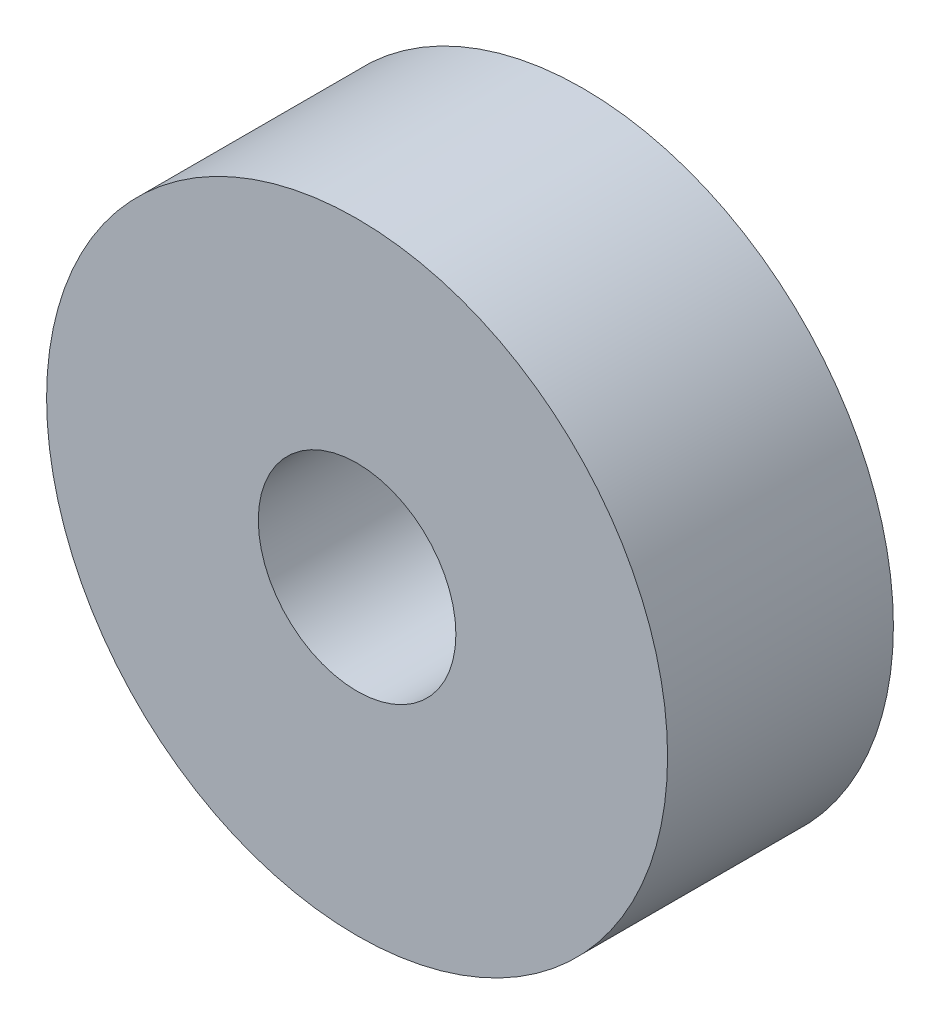
ISO-10303-21;
HEADER;
FILE_DESCRIPTION(('STEP AP214'),'2;1');
FILE_NAME('part.step','',(''),(''),'','','');
FILE_SCHEMA(('AUTOMOTIVE_DESIGN { 1 0 10303 214 1 1 1 1 }'));
ENDSEC;
DATA;
#1=APPLICATION_CONTEXT('core data for automotive mechanical design processes');
#2=APPLICATION_PROTOCOL_DEFINITION('international standard','automotive_design',2000,#1);
#3=PRODUCT_CONTEXT('',#1,'mechanical');
#4=PRODUCT('Part','Part','',(#3));
#5=PRODUCT_RELATED_PRODUCT_CATEGORY('part','',(#4));
#6=PRODUCT_DEFINITION_FORMATION('','',#4);
#7=PRODUCT_DEFINITION_CONTEXT('part definition',#1,'design');
#8=PRODUCT_DEFINITION('design','',#6,#7);
#9=PRODUCT_DEFINITION_SHAPE('','',#8);
#10=(LENGTH_UNIT() NAMED_UNIT(*) SI_UNIT(.MILLI.,.METRE.));
#11=(NAMED_UNIT(*) PLANE_ANGLE_UNIT() SI_UNIT($,.RADIAN.));
#12=(NAMED_UNIT(*) SI_UNIT($,.STERADIAN.) SOLID_ANGLE_UNIT());
#13=UNCERTAINTY_MEASURE_WITH_UNIT(LENGTH_MEASURE(1.E-05),#10,'distance_accuracy_value','');
#14=(GEOMETRIC_REPRESENTATION_CONTEXT(3) GLOBAL_UNCERTAINTY_ASSIGNED_CONTEXT((#13)) GLOBAL_UNIT_ASSIGNED_CONTEXT((#10,
#11,#12)) REPRESENTATION_CONTEXT('',''));
#15=CARTESIAN_POINT('',(0.,0.,0.));
#16=DIRECTION('',(0.,0.,1.));
#17=DIRECTION('',(1.,0.,0.));
#18=AXIS2_PLACEMENT_3D('',#15,#16,#17);
#19=CARTESIAN_POINT('',(31.9155912475696,315.,8.));
#20=DIRECTION('',(0.,0.,1.));
#21=DIRECTION('',(1.,0.,0.));
#22=AXIS2_PLACEMENT_3D('',#19,#20,#21);
#23=PLANE('',#22);
#24=CARTESIAN_POINT('',(31.9155912475696,315.,8.));
#25=DIRECTION('',(0.,0.,1.));
#26=DIRECTION('',(1.,0.,0.));
#27=AXIS2_PLACEMENT_3D('',#24,#25,#26);
#28=CIRCLE('',#27,11.);
#29=CARTESIAN_POINT('',(42.9155912475697,315.,8.));
#30=VERTEX_POINT('',#29);
#31=EDGE_CURVE('E10',#30,#30,#28,.T.);
#32=ORIENTED_EDGE('',*,*,#31,.T.);
#33=EDGE_LOOP('',(#32));
#34=FACE_BOUND('',#33,.T.);
#35=CARTESIAN_POINT('',(31.9155912475696,315.,8.));
#36=DIRECTION('',(0.,0.,1.));
#37=DIRECTION('',(1.,0.,0.));
#38=AXIS2_PLACEMENT_3D('',#35,#36,#37);
#39=CIRCLE('',#38,3.5);
#40=CARTESIAN_POINT('',(35.4155912475696,315.,8.));
#41=VERTEX_POINT('',#40);
#42=EDGE_CURVE('E40',#41,#41,#39,.T.);
#43=ORIENTED_EDGE('',*,*,#42,.F.);
#44=EDGE_LOOP('',(#43));
#45=FACE_BOUND('',#44,.T.);
#46=ADVANCED_FACE('F29',(#34,#45),#23,.T.);
#47=CARTESIAN_POINT('',(31.9155912475696,315.,0.));
#48=DIRECTION('',(0.,0.,1.));
#49=DIRECTION('',(1.,0.,0.));
#50=AXIS2_PLACEMENT_3D('',#47,#48,#49);
#51=PLANE('',#50);
#52=CARTESIAN_POINT('',(31.9155912475696,315.,0.));
#53=DIRECTION('',(0.,0.,1.));
#54=DIRECTION('',(1.,0.,0.));
#55=AXIS2_PLACEMENT_3D('',#52,#53,#54);
#56=CIRCLE('',#55,11.);
#57=CARTESIAN_POINT('',(42.9155912475697,315.,0.));
#58=VERTEX_POINT('',#57);
#59=EDGE_CURVE('E33',#58,#58,#56,.T.);
#60=ORIENTED_EDGE('',*,*,#59,.F.);
#61=EDGE_LOOP('',(#60));
#62=FACE_BOUND('',#61,.T.);
#63=CARTESIAN_POINT('',(31.9155912475696,315.,0.));
#64=DIRECTION('',(0.,0.,1.));
#65=DIRECTION('',(1.,0.,0.));
#66=AXIS2_PLACEMENT_3D('',#63,#64,#65);
#67=CIRCLE('',#66,3.5);
#68=CARTESIAN_POINT('',(35.4155912475696,315.,0.));
#69=VERTEX_POINT('',#68);
#70=EDGE_CURVE('E42',#69,#69,#67,.T.);
#71=ORIENTED_EDGE('',*,*,#70,.T.);
#72=EDGE_LOOP('',(#71));
#73=FACE_BOUND('',#72,.T.);
#74=ADVANCED_FACE('F52',(#62,#73),#51,.F.);
#75=CARTESIAN_POINT('',(31.9155912475696,315.,8.));
#76=DIRECTION('',(0.,0.,-1.));
#77=DIRECTION('',(-1.,0.,0.));
#78=AXIS2_PLACEMENT_3D('',#75,#76,#77);
#79=CYLINDRICAL_SURFACE('',#78,11.);
#80=ORIENTED_EDGE('',*,*,#31,.F.);
#81=EDGE_LOOP('',(#80));
#82=FACE_BOUND('',#81,.T.);
#83=ORIENTED_EDGE('',*,*,#59,.T.);
#84=EDGE_LOOP('',(#83));
#85=FACE_BOUND('',#84,.T.);
#86=ADVANCED_FACE('F31',(#82,#85),#79,.T.);
#87=CARTESIAN_POINT('',(31.9155912475696,315.,8.));
#88=DIRECTION('',(0.,0.,-1.));
#89=DIRECTION('',(-1.,0.,0.));
#90=AXIS2_PLACEMENT_3D('',#87,#88,#89);
#91=CYLINDRICAL_SURFACE('',#90,3.5);
#92=ORIENTED_EDGE('',*,*,#42,.T.);
#93=EDGE_LOOP('',(#92));
#94=FACE_BOUND('',#93,.T.);
#95=ORIENTED_EDGE('',*,*,#70,.F.);
#96=EDGE_LOOP('',(#95));
#97=FACE_BOUND('',#96,.T.);
#98=ADVANCED_FACE('F48',(#94,#97),#91,.F.);
#99=CLOSED_SHELL('',(#46,#74,#86,#98));
#100=MANIFOLD_SOLID_BREP('B2',#99);
#101=ADVANCED_BREP_SHAPE_REPRESENTATION('',(#18,#100),#14);
#102=SHAPE_DEFINITION_REPRESENTATION(#9,#101);
ENDSEC;
END-ISO-10303-21;
